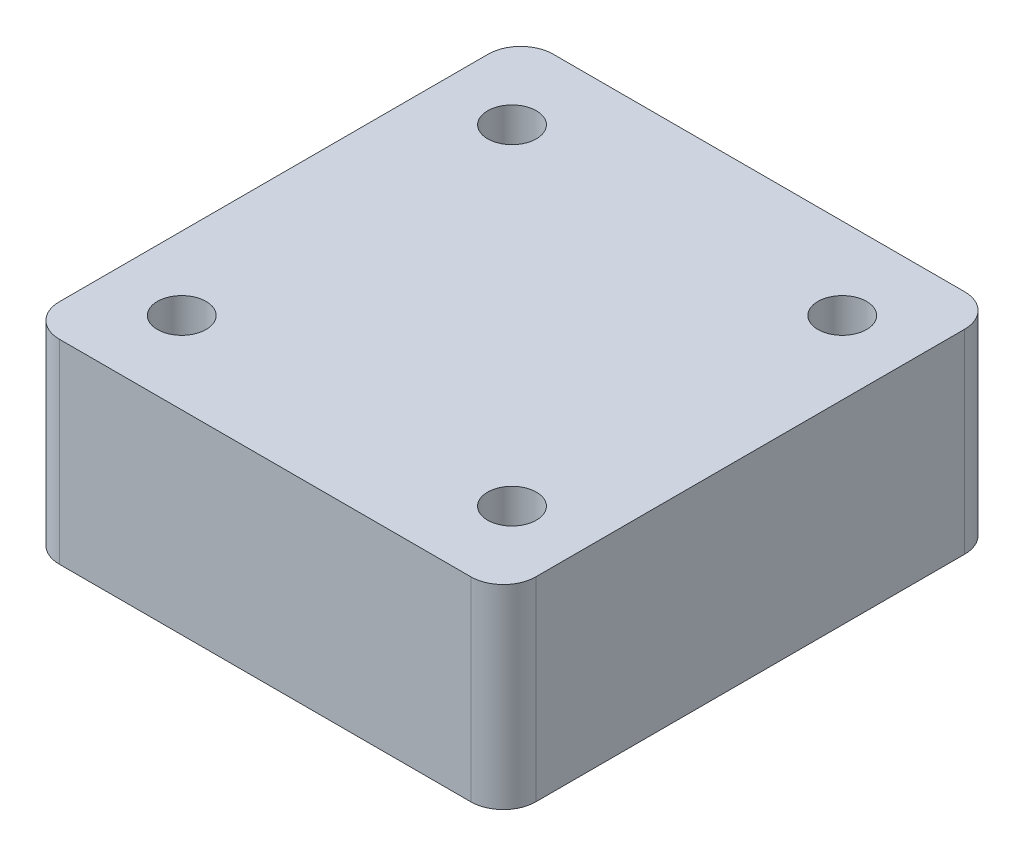
ISO-10303-21;
HEADER;
FILE_DESCRIPTION(('STEP AP214'),'2;1');
FILE_NAME('part.step','',(''),(''),'','','');
FILE_SCHEMA(('AUTOMOTIVE_DESIGN { 1 0 10303 214 1 1 1 1 }'));
ENDSEC;
DATA;
#1=APPLICATION_CONTEXT('core data for automotive mechanical design processes');
#2=APPLICATION_PROTOCOL_DEFINITION('international standard','automotive_design',2000,#1);
#3=PRODUCT_CONTEXT('',#1,'mechanical');
#4=PRODUCT('Part','Part','',(#3));
#5=PRODUCT_RELATED_PRODUCT_CATEGORY('part','',(#4));
#6=PRODUCT_DEFINITION_FORMATION('','',#4);
#7=PRODUCT_DEFINITION_CONTEXT('part definition',#1,'design');
#8=PRODUCT_DEFINITION('design','',#6,#7);
#9=PRODUCT_DEFINITION_SHAPE('','',#8);
#10=(LENGTH_UNIT() NAMED_UNIT(*) SI_UNIT(.MILLI.,.METRE.));
#11=(NAMED_UNIT(*) PLANE_ANGLE_UNIT() SI_UNIT($,.RADIAN.));
#12=(NAMED_UNIT(*) SI_UNIT($,.STERADIAN.) SOLID_ANGLE_UNIT());
#13=UNCERTAINTY_MEASURE_WITH_UNIT(LENGTH_MEASURE(1.E-05),#10,'distance_accuracy_value','');
#14=(GEOMETRIC_REPRESENTATION_CONTEXT(3) GLOBAL_UNCERTAINTY_ASSIGNED_CONTEXT((#13)) GLOBAL_UNIT_ASSIGNED_CONTEXT((#10,
#11,#12)) REPRESENTATION_CONTEXT('',''));
#15=CARTESIAN_POINT('',(0.,0.,0.));
#16=DIRECTION('',(0.,0.,1.));
#17=DIRECTION('',(1.,0.,0.));
#18=AXIS2_PLACEMENT_3D('',#15,#16,#17);
#19=CARTESIAN_POINT('',(22.,18.,-22.8));
#20=DIRECTION('',(-1.,0.,0.));
#21=DIRECTION('',(0.,0.,1.));
#22=AXIS2_PLACEMENT_3D('',#19,#20,#21);
#23=PLANE('',#22);
#24=DIRECTION('',(0.,0.,-1.));
#25=VECTOR('',#24,1.);
#26=CARTESIAN_POINT('',(22.,0.,-22.8));
#27=LINE('',#26,#25);
#28=CARTESIAN_POINT('',(22.,0.,19.8));
#29=VERTEX_POINT('',#28);
#30=CARTESIAN_POINT('',(22.,0.,-19.8));
#31=VERTEX_POINT('',#30);
#32=EDGE_CURVE('E143',#29,#31,#27,.T.);
#33=ORIENTED_EDGE('',*,*,#32,.T.);
#34=DIRECTION('',(0.,-1.,0.));
#35=VECTOR('',#34,1.);
#36=CARTESIAN_POINT('',(22.,18.,-19.8));
#37=LINE('',#36,#35);
#38=CARTESIAN_POINT('',(22.,18.,-19.8));
#39=VERTEX_POINT('',#38);
#40=EDGE_CURVE('E177',#31,#39,#37,.F.);
#41=ORIENTED_EDGE('',*,*,#40,.T.);
#42=DIRECTION('',(0.,0.,-1.));
#43=VECTOR('',#42,1.);
#44=CARTESIAN_POINT('',(22.,18.,-22.8));
#45=LINE('',#44,#43);
#46=CARTESIAN_POINT('',(22.,18.,19.8));
#47=VERTEX_POINT('',#46);
#48=EDGE_CURVE('E141',#47,#39,#45,.T.);
#49=ORIENTED_EDGE('',*,*,#48,.F.);
#50=DIRECTION('',(0.,-1.,0.));
#51=VECTOR('',#50,1.);
#52=CARTESIAN_POINT('',(22.,18.,19.8));
#53=LINE('',#52,#51);
#54=EDGE_CURVE('E173',#47,#29,#53,.T.);
#55=ORIENTED_EDGE('',*,*,#54,.T.);
#56=EDGE_LOOP('',(#33,#41,#49,#55));
#57=FACE_BOUND('',#56,.T.);
#58=ADVANCED_FACE('F42',(#57),#23,.F.);
#59=CARTESIAN_POINT('',(-22.,18.,-22.8));
#60=DIRECTION('',(0.,0.,1.));
#61=DIRECTION('',(1.,0.,0.));
#62=AXIS2_PLACEMENT_3D('',#59,#60,#61);
#63=PLANE('',#62);
#64=DIRECTION('',(-1.,0.,0.));
#65=VECTOR('',#64,1.);
#66=CARTESIAN_POINT('',(-22.,0.,-22.8));
#67=LINE('',#66,#65);
#68=CARTESIAN_POINT('',(19.,0.,-22.8));
#69=VERTEX_POINT('',#68);
#70=CARTESIAN_POINT('',(-19.,0.,-22.8));
#71=VERTEX_POINT('',#70);
#72=EDGE_CURVE('E137',#69,#71,#67,.T.);
#73=ORIENTED_EDGE('',*,*,#72,.T.);
#74=DIRECTION('',(0.,-1.,0.));
#75=VECTOR('',#74,1.);
#76=CARTESIAN_POINT('',(-19.,18.,-22.8));
#77=LINE('',#76,#75);
#78=CARTESIAN_POINT('',(-19.,18.,-22.8));
#79=VERTEX_POINT('',#78);
#80=EDGE_CURVE('E113',#71,#79,#77,.F.);
#81=ORIENTED_EDGE('',*,*,#80,.T.);
#82=DIRECTION('',(-1.,0.,0.));
#83=VECTOR('',#82,1.);
#84=CARTESIAN_POINT('',(-22.,18.,-22.8));
#85=LINE('',#84,#83);
#86=CARTESIAN_POINT('',(19.,18.,-22.8));
#87=VERTEX_POINT('',#86);
#88=EDGE_CURVE('E196',#87,#79,#85,.T.);
#89=ORIENTED_EDGE('',*,*,#88,.F.);
#90=DIRECTION('',(0.,-1.,0.));
#91=VECTOR('',#90,1.);
#92=CARTESIAN_POINT('',(19.,18.,-22.8));
#93=LINE('',#92,#91);
#94=EDGE_CURVE('E119',#87,#69,#93,.T.);
#95=ORIENTED_EDGE('',*,*,#94,.T.);
#96=EDGE_LOOP('',(#73,#81,#89,#95));
#97=FACE_BOUND('',#96,.T.);
#98=ADVANCED_FACE('F257',(#97),#63,.F.);
#99=CARTESIAN_POINT('',(-22.,18.,-22.8));
#100=DIRECTION('',(1.,0.,0.));
#101=DIRECTION('',(0.,0.,-1.));
#102=AXIS2_PLACEMENT_3D('',#99,#100,#101);
#103=PLANE('',#102);
#104=DIRECTION('',(0.,0.,1.));
#105=VECTOR('',#104,1.);
#106=CARTESIAN_POINT('',(-22.,18.,-22.8));
#107=LINE('',#106,#105);
#108=CARTESIAN_POINT('',(-22.,18.,-19.8));
#109=VERTEX_POINT('',#108);
#110=CARTESIAN_POINT('',(-22.,18.,19.8));
#111=VERTEX_POINT('',#110);
#112=EDGE_CURVE('E128',#109,#111,#107,.T.);
#113=ORIENTED_EDGE('',*,*,#112,.F.);
#114=DIRECTION('',(0.,-1.,0.));
#115=VECTOR('',#114,1.);
#116=CARTESIAN_POINT('',(-22.,18.,-19.8));
#117=LINE('',#116,#115);
#118=CARTESIAN_POINT('',(-22.,0.,-19.8));
#119=VERTEX_POINT('',#118);
#120=EDGE_CURVE('E112',#109,#119,#117,.T.);
#121=ORIENTED_EDGE('',*,*,#120,.T.);
#122=DIRECTION('',(0.,0.,1.));
#123=VECTOR('',#122,1.);
#124=CARTESIAN_POINT('',(-22.,0.,-22.8));
#125=LINE('',#124,#123);
#126=CARTESIAN_POINT('',(-22.,0.,19.8));
#127=VERTEX_POINT('',#126);
#128=EDGE_CURVE('E126',#119,#127,#125,.T.);
#129=ORIENTED_EDGE('',*,*,#128,.T.);
#130=DIRECTION('',(0.,-1.,0.));
#131=VECTOR('',#130,1.);
#132=CARTESIAN_POINT('',(-22.,18.,19.8));
#133=LINE('',#132,#131);
#134=EDGE_CURVE('E131',#127,#111,#133,.F.);
#135=ORIENTED_EDGE('',*,*,#134,.T.);
#136=EDGE_LOOP('',(#113,#121,#129,#135));
#137=FACE_BOUND('',#136,.T.);
#138=ADVANCED_FACE('F125',(#137),#103,.F.);
#139=CARTESIAN_POINT('',(-22.,18.,22.8));
#140=DIRECTION('',(0.,0.,-1.));
#141=DIRECTION('',(-1.,0.,0.));
#142=AXIS2_PLACEMENT_3D('',#139,#140,#141);
#143=PLANE('',#142);
#144=DIRECTION('',(1.,0.,0.));
#145=VECTOR('',#144,1.);
#146=CARTESIAN_POINT('',(-22.,0.,22.8));
#147=LINE('',#146,#145);
#148=CARTESIAN_POINT('',(-19.,0.,22.8));
#149=VERTEX_POINT('',#148);
#150=CARTESIAN_POINT('',(19.,0.,22.8));
#151=VERTEX_POINT('',#150);
#152=EDGE_CURVE('E136',#149,#151,#147,.T.);
#153=ORIENTED_EDGE('',*,*,#152,.T.);
#154=DIRECTION('',(0.,-1.,0.));
#155=VECTOR('',#154,1.);
#156=CARTESIAN_POINT('',(19.,18.,22.8));
#157=LINE('',#156,#155);
#158=CARTESIAN_POINT('',(19.,18.,22.8));
#159=VERTEX_POINT('',#158);
#160=EDGE_CURVE('E11',#151,#159,#157,.F.);
#161=ORIENTED_EDGE('',*,*,#160,.T.);
#162=DIRECTION('',(1.,0.,0.));
#163=VECTOR('',#162,1.);
#164=CARTESIAN_POINT('',(-22.,18.,22.8));
#165=LINE('',#164,#163);
#166=CARTESIAN_POINT('',(-19.,18.,22.8));
#167=VERTEX_POINT('',#166);
#168=EDGE_CURVE('E148',#167,#159,#165,.T.);
#169=ORIENTED_EDGE('',*,*,#168,.F.);
#170=DIRECTION('',(0.,-1.,0.));
#171=VECTOR('',#170,1.);
#172=CARTESIAN_POINT('',(-19.,18.,22.8));
#173=LINE('',#172,#171);
#174=EDGE_CURVE('E51',#167,#149,#173,.T.);
#175=ORIENTED_EDGE('',*,*,#174,.T.);
#176=EDGE_LOOP('',(#153,#161,#169,#175));
#177=FACE_BOUND('',#176,.T.);
#178=ADVANCED_FACE('F182',(#177),#143,.F.);
#179=CARTESIAN_POINT('',(0.,18.,0.));
#180=DIRECTION('',(0.,1.,0.));
#181=DIRECTION('',(0.,0.,1.));
#182=AXIS2_PLACEMENT_3D('',#179,#180,#181);
#183=PLANE('',#182);
#184=CARTESIAN_POINT('',(15.25,18.,15.25));
#185=DIRECTION('',(0.,1.,0.));
#186=DIRECTION('',(0.,0.,1.));
#187=AXIS2_PLACEMENT_3D('',#184,#185,#186);
#188=CIRCLE('',#187,2.24999999999999);
#189=CARTESIAN_POINT('',(15.25,18.,17.5));
#190=VERTEX_POINT('',#189);
#191=EDGE_CURVE('E239',#190,#190,#188,.T.);
#192=ORIENTED_EDGE('',*,*,#191,.F.);
#193=EDGE_LOOP('',(#192));
#194=FACE_BOUND('',#193,.T.);
#195=CARTESIAN_POINT('',(-15.25,18.,-15.25));
#196=DIRECTION('',(0.,1.,0.));
#197=DIRECTION('',(0.,0.,1.));
#198=AXIS2_PLACEMENT_3D('',#195,#196,#197);
#199=CIRCLE('',#198,2.24999999999999);
#200=CARTESIAN_POINT('',(-15.25,18.,-13.));
#201=VERTEX_POINT('',#200);
#202=EDGE_CURVE('E231',#201,#201,#199,.T.);
#203=ORIENTED_EDGE('',*,*,#202,.F.);
#204=EDGE_LOOP('',(#203));
#205=FACE_BOUND('',#204,.T.);
#206=CARTESIAN_POINT('',(-15.25,18.,15.25));
#207=DIRECTION('',(0.,1.,0.));
#208=DIRECTION('',(0.,0.,1.));
#209=AXIS2_PLACEMENT_3D('',#206,#207,#208);
#210=CIRCLE('',#209,2.24999999999999);
#211=CARTESIAN_POINT('',(-15.25,18.,17.5));
#212=VERTEX_POINT('',#211);
#213=EDGE_CURVE('E221',#212,#212,#210,.T.);
#214=ORIENTED_EDGE('',*,*,#213,.F.);
#215=EDGE_LOOP('',(#214));
#216=FACE_BOUND('',#215,.T.);
#217=CARTESIAN_POINT('',(15.25,18.,-15.25));
#218=DIRECTION('',(0.,1.,0.));
#219=DIRECTION('',(0.,0.,1.));
#220=AXIS2_PLACEMENT_3D('',#217,#218,#219);
#221=CIRCLE('',#220,2.24999999999999);
#222=CARTESIAN_POINT('',(15.25,18.,-13.));
#223=VERTEX_POINT('',#222);
#224=EDGE_CURVE('E211',#223,#223,#221,.T.);
#225=ORIENTED_EDGE('',*,*,#224,.F.);
#226=EDGE_LOOP('',(#225));
#227=FACE_BOUND('',#226,.T.);
#228=ORIENTED_EDGE('',*,*,#88,.T.);
#229=CARTESIAN_POINT('',(-19.,18.,-19.8));
#230=DIRECTION('',(0.,1.,0.));
#231=DIRECTION('',(0.,0.,1.));
#232=AXIS2_PLACEMENT_3D('',#229,#230,#231);
#233=CIRCLE('',#232,3.);
#234=EDGE_CURVE('E170',#79,#109,#233,.T.);
#235=ORIENTED_EDGE('',*,*,#234,.T.);
#236=ORIENTED_EDGE('',*,*,#112,.T.);
#237=CARTESIAN_POINT('',(-19.,18.,19.8));
#238=DIRECTION('',(0.,1.,0.));
#239=DIRECTION('',(0.,0.,1.));
#240=AXIS2_PLACEMENT_3D('',#237,#238,#239);
#241=CIRCLE('',#240,3.);
#242=EDGE_CURVE('E63',#111,#167,#241,.T.);
#243=ORIENTED_EDGE('',*,*,#242,.T.);
#244=ORIENTED_EDGE('',*,*,#168,.T.);
#245=CARTESIAN_POINT('',(19.,18.,19.8));
#246=DIRECTION('',(0.,1.,0.));
#247=DIRECTION('',(0.,0.,1.));
#248=AXIS2_PLACEMENT_3D('',#245,#246,#247);
#249=CIRCLE('',#248,3.);
#250=EDGE_CURVE('E164',#159,#47,#249,.T.);
#251=ORIENTED_EDGE('',*,*,#250,.T.);
#252=ORIENTED_EDGE('',*,*,#48,.T.);
#253=CARTESIAN_POINT('',(19.,18.,-19.8));
#254=DIRECTION('',(0.,1.,0.));
#255=DIRECTION('',(0.,0.,1.));
#256=AXIS2_PLACEMENT_3D('',#253,#254,#255);
#257=CIRCLE('',#256,3.);
#258=EDGE_CURVE('E167',#39,#87,#257,.T.);
#259=ORIENTED_EDGE('',*,*,#258,.T.);
#260=EDGE_LOOP('',(#228,#235,#236,#243,#244,#251,#252,#259));
#261=FACE_BOUND('',#260,.T.);
#262=ADVANCED_FACE('F246',(#194,#205,#216,#227,#261),#183,.T.);
#263=CARTESIAN_POINT('',(0.,0.,0.));
#264=DIRECTION('',(0.,1.,0.));
#265=DIRECTION('',(0.,0.,1.));
#266=AXIS2_PLACEMENT_3D('',#263,#264,#265);
#267=PLANE('',#266);
#268=CARTESIAN_POINT('',(15.25,0.,15.25));
#269=DIRECTION('',(0.,1.,0.));
#270=DIRECTION('',(0.,0.,1.));
#271=AXIS2_PLACEMENT_3D('',#268,#269,#270);
#272=CIRCLE('',#271,2.25);
#273=CARTESIAN_POINT('',(15.25,0.,17.5));
#274=VERTEX_POINT('',#273);
#275=EDGE_CURVE('E235',#274,#274,#272,.T.);
#276=ORIENTED_EDGE('',*,*,#275,.T.);
#277=EDGE_LOOP('',(#276));
#278=FACE_BOUND('',#277,.T.);
#279=CARTESIAN_POINT('',(-15.25,0.,-15.25));
#280=DIRECTION('',(0.,1.,0.));
#281=DIRECTION('',(0.,0.,1.));
#282=AXIS2_PLACEMENT_3D('',#279,#280,#281);
#283=CIRCLE('',#282,2.25);
#284=CARTESIAN_POINT('',(-15.25,0.,-13.));
#285=VERTEX_POINT('',#284);
#286=EDGE_CURVE('E227',#285,#285,#283,.T.);
#287=ORIENTED_EDGE('',*,*,#286,.T.);
#288=EDGE_LOOP('',(#287));
#289=FACE_BOUND('',#288,.T.);
#290=CARTESIAN_POINT('',(-15.25,0.,15.25));
#291=DIRECTION('',(0.,1.,0.));
#292=DIRECTION('',(0.,0.,1.));
#293=AXIS2_PLACEMENT_3D('',#290,#291,#292);
#294=CIRCLE('',#293,2.25);
#295=CARTESIAN_POINT('',(-15.25,0.,17.5));
#296=VERTEX_POINT('',#295);
#297=EDGE_CURVE('E216',#296,#296,#294,.T.);
#298=ORIENTED_EDGE('',*,*,#297,.T.);
#299=EDGE_LOOP('',(#298));
#300=FACE_BOUND('',#299,.T.);
#301=CARTESIAN_POINT('',(15.25,0.,-15.25));
#302=DIRECTION('',(0.,1.,0.));
#303=DIRECTION('',(0.,0.,1.));
#304=AXIS2_PLACEMENT_3D('',#301,#302,#303);
#305=CIRCLE('',#304,2.25);
#306=CARTESIAN_POINT('',(15.25,0.,-13.));
#307=VERTEX_POINT('',#306);
#308=EDGE_CURVE('E202',#307,#307,#305,.T.);
#309=ORIENTED_EDGE('',*,*,#308,.T.);
#310=EDGE_LOOP('',(#309));
#311=FACE_BOUND('',#310,.T.);
#312=ORIENTED_EDGE('',*,*,#128,.F.);
#313=CARTESIAN_POINT('',(-19.,0.,-19.8));
#314=DIRECTION('',(0.,1.,0.));
#315=DIRECTION('',(0.,0.,1.));
#316=AXIS2_PLACEMENT_3D('',#313,#314,#315);
#317=CIRCLE('',#316,3.);
#318=EDGE_CURVE('E108',#119,#71,#317,.F.);
#319=ORIENTED_EDGE('',*,*,#318,.T.);
#320=ORIENTED_EDGE('',*,*,#72,.F.);
#321=CARTESIAN_POINT('',(19.,0.,-19.8));
#322=DIRECTION('',(0.,1.,0.));
#323=DIRECTION('',(0.,0.,1.));
#324=AXIS2_PLACEMENT_3D('',#321,#322,#323);
#325=CIRCLE('',#324,3.);
#326=EDGE_CURVE('E120',#69,#31,#325,.F.);
#327=ORIENTED_EDGE('',*,*,#326,.T.);
#328=ORIENTED_EDGE('',*,*,#32,.F.);
#329=CARTESIAN_POINT('',(19.,0.,19.8));
#330=DIRECTION('',(0.,1.,0.));
#331=DIRECTION('',(0.,0.,1.));
#332=AXIS2_PLACEMENT_3D('',#329,#330,#331);
#333=CIRCLE('',#332,3.);
#334=EDGE_CURVE('E152',#29,#151,#333,.F.);
#335=ORIENTED_EDGE('',*,*,#334,.T.);
#336=ORIENTED_EDGE('',*,*,#152,.F.);
#337=CARTESIAN_POINT('',(-19.,0.,19.8));
#338=DIRECTION('',(0.,1.,0.));
#339=DIRECTION('',(0.,0.,1.));
#340=AXIS2_PLACEMENT_3D('',#337,#338,#339);
#341=CIRCLE('',#340,3.);
#342=EDGE_CURVE('E130',#149,#127,#341,.F.);
#343=ORIENTED_EDGE('',*,*,#342,.T.);
#344=EDGE_LOOP('',(#312,#319,#320,#327,#328,#335,#336,#343));
#345=FACE_BOUND('',#344,.T.);
#346=ADVANCED_FACE('F133',(#278,#289,#300,#311,#345),#267,.F.);
#347=CARTESIAN_POINT('',(-19.,18.,-19.8));
#348=DIRECTION('',(0.,-1.,0.));
#349=DIRECTION('',(0.,0.,-1.));
#350=AXIS2_PLACEMENT_3D('',#347,#348,#349);
#351=CYLINDRICAL_SURFACE('',#350,3.);
#352=ORIENTED_EDGE('',*,*,#234,.F.);
#353=ORIENTED_EDGE('',*,*,#80,.F.);
#354=ORIENTED_EDGE('',*,*,#318,.F.);
#355=ORIENTED_EDGE('',*,*,#120,.F.);
#356=EDGE_LOOP('',(#352,#353,#354,#355));
#357=FACE_BOUND('',#356,.T.);
#358=ADVANCED_FACE('F111',(#357),#351,.T.);
#359=CARTESIAN_POINT('',(19.,18.,-19.8));
#360=DIRECTION('',(0.,-1.,0.));
#361=DIRECTION('',(0.,0.,-1.));
#362=AXIS2_PLACEMENT_3D('',#359,#360,#361);
#363=CYLINDRICAL_SURFACE('',#362,3.);
#364=ORIENTED_EDGE('',*,*,#258,.F.);
#365=ORIENTED_EDGE('',*,*,#40,.F.);
#366=ORIENTED_EDGE('',*,*,#326,.F.);
#367=ORIENTED_EDGE('',*,*,#94,.F.);
#368=EDGE_LOOP('',(#364,#365,#366,#367));
#369=FACE_BOUND('',#368,.T.);
#370=ADVANCED_FACE('F259',(#369),#363,.T.);
#371=CARTESIAN_POINT('',(19.,18.,19.8));
#372=DIRECTION('',(0.,-1.,0.));
#373=DIRECTION('',(0.,0.,-1.));
#374=AXIS2_PLACEMENT_3D('',#371,#372,#373);
#375=CYLINDRICAL_SURFACE('',#374,3.);
#376=ORIENTED_EDGE('',*,*,#250,.F.);
#377=ORIENTED_EDGE('',*,*,#160,.F.);
#378=ORIENTED_EDGE('',*,*,#334,.F.);
#379=ORIENTED_EDGE('',*,*,#54,.F.);
#380=EDGE_LOOP('',(#376,#377,#378,#379));
#381=FACE_BOUND('',#380,.T.);
#382=ADVANCED_FACE('F189',(#381),#375,.T.);
#383=CARTESIAN_POINT('',(-19.,18.,19.8));
#384=DIRECTION('',(0.,-1.,0.));
#385=DIRECTION('',(0.,0.,-1.));
#386=AXIS2_PLACEMENT_3D('',#383,#384,#385);
#387=CYLINDRICAL_SURFACE('',#386,3.);
#388=ORIENTED_EDGE('',*,*,#242,.F.);
#389=ORIENTED_EDGE('',*,*,#134,.F.);
#390=ORIENTED_EDGE('',*,*,#342,.F.);
#391=ORIENTED_EDGE('',*,*,#174,.F.);
#392=EDGE_LOOP('',(#388,#389,#390,#391));
#393=FACE_BOUND('',#392,.T.);
#394=ADVANCED_FACE('F44',(#393),#387,.T.);
#395=CARTESIAN_POINT('',(15.25,18.,-15.25));
#396=DIRECTION('',(0.,1.,0.));
#397=DIRECTION('',(0.,0.,1.));
#398=AXIS2_PLACEMENT_3D('',#395,#396,#397);
#399=CYLINDRICAL_SURFACE('',#398,2.24999999999999);
#400=ORIENTED_EDGE('',*,*,#308,.F.);
#401=EDGE_LOOP('',(#400));
#402=FACE_BOUND('',#401,.T.);
#403=ORIENTED_EDGE('',*,*,#224,.T.);
#404=EDGE_LOOP('',(#403));
#405=FACE_BOUND('',#404,.T.);
#406=ADVANCED_FACE('F281',(#402,#405),#399,.F.);
#407=CARTESIAN_POINT('',(-15.25,18.,15.25));
#408=DIRECTION('',(0.,1.,0.));
#409=DIRECTION('',(0.,0.,1.));
#410=AXIS2_PLACEMENT_3D('',#407,#408,#409);
#411=CYLINDRICAL_SURFACE('',#410,2.24999999999999);
#412=ORIENTED_EDGE('',*,*,#297,.F.);
#413=EDGE_LOOP('',(#412));
#414=FACE_BOUND('',#413,.T.);
#415=ORIENTED_EDGE('',*,*,#213,.T.);
#416=EDGE_LOOP('',(#415));
#417=FACE_BOUND('',#416,.T.);
#418=ADVANCED_FACE('F284',(#414,#417),#411,.F.);
#419=CARTESIAN_POINT('',(-15.25,18.,-15.25));
#420=DIRECTION('',(0.,1.,0.));
#421=DIRECTION('',(0.,0.,1.));
#422=AXIS2_PLACEMENT_3D('',#419,#420,#421);
#423=CYLINDRICAL_SURFACE('',#422,2.24999999999999);
#424=ORIENTED_EDGE('',*,*,#286,.F.);
#425=EDGE_LOOP('',(#424));
#426=FACE_BOUND('',#425,.T.);
#427=ORIENTED_EDGE('',*,*,#202,.T.);
#428=EDGE_LOOP('',(#427));
#429=FACE_BOUND('',#428,.T.);
#430=ADVANCED_FACE('F288',(#426,#429),#423,.F.);
#431=CARTESIAN_POINT('',(15.25,18.,15.25));
#432=DIRECTION('',(0.,1.,0.));
#433=DIRECTION('',(0.,0.,1.));
#434=AXIS2_PLACEMENT_3D('',#431,#432,#433);
#435=CYLINDRICAL_SURFACE('',#434,2.24999999999999);
#436=ORIENTED_EDGE('',*,*,#275,.F.);
#437=EDGE_LOOP('',(#436));
#438=FACE_BOUND('',#437,.T.);
#439=ORIENTED_EDGE('',*,*,#191,.T.);
#440=EDGE_LOOP('',(#439));
#441=FACE_BOUND('',#440,.T.);
#442=ADVANCED_FACE('F244',(#438,#441),#435,.F.);
#443=CLOSED_SHELL('',(#58,#98,#138,#178,#262,#346,#358,#370,#382,#394,#406,#418,#430,#442));
#444=MANIFOLD_SOLID_BREP('B2',#443);
#445=ADVANCED_BREP_SHAPE_REPRESENTATION('',(#18,#444),#14);
#446=SHAPE_DEFINITION_REPRESENTATION(#9,#445);
ENDSEC;
END-ISO-10303-21;
